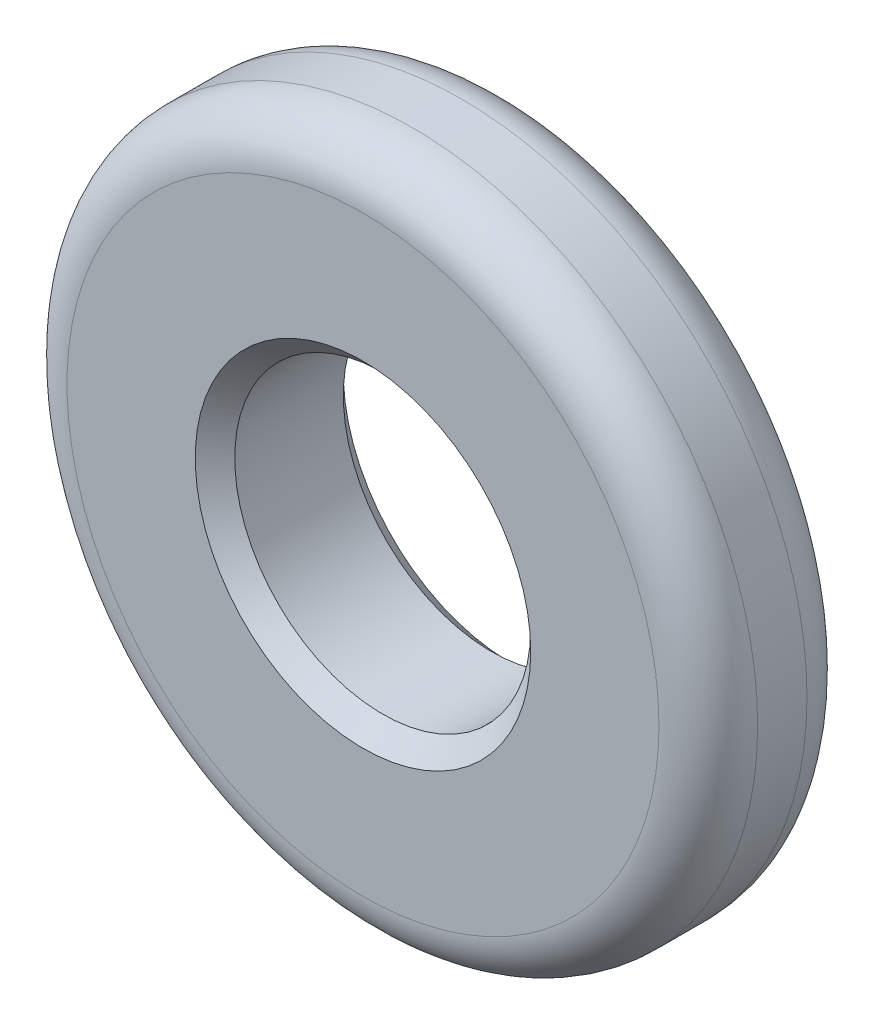
ISO-10303-21;
HEADER;
FILE_DESCRIPTION(('STEP AP214'),'2;1');
FILE_NAME('part.step','',(''),(''),'','','');
FILE_SCHEMA(('AUTOMOTIVE_DESIGN { 1 0 10303 214 1 1 1 1 }'));
ENDSEC;
DATA;
#1=APPLICATION_CONTEXT('core data for automotive mechanical design processes');
#2=APPLICATION_PROTOCOL_DEFINITION('international standard','automotive_design',2000,#1);
#3=PRODUCT_CONTEXT('',#1,'mechanical');
#4=PRODUCT('Part','Part','',(#3));
#5=PRODUCT_RELATED_PRODUCT_CATEGORY('part','',(#4));
#6=PRODUCT_DEFINITION_FORMATION('','',#4);
#7=PRODUCT_DEFINITION_CONTEXT('part definition',#1,'design');
#8=PRODUCT_DEFINITION('design','',#6,#7);
#9=PRODUCT_DEFINITION_SHAPE('','',#8);
#10=(LENGTH_UNIT() NAMED_UNIT(*) SI_UNIT(.MILLI.,.METRE.));
#11=(NAMED_UNIT(*) PLANE_ANGLE_UNIT() SI_UNIT($,.RADIAN.));
#12=(NAMED_UNIT(*) SI_UNIT($,.STERADIAN.) SOLID_ANGLE_UNIT());
#13=UNCERTAINTY_MEASURE_WITH_UNIT(LENGTH_MEASURE(1.E-05),#10,'distance_accuracy_value','');
#14=(GEOMETRIC_REPRESENTATION_CONTEXT(3) GLOBAL_UNCERTAINTY_ASSIGNED_CONTEXT((#13)) GLOBAL_UNIT_ASSIGNED_CONTEXT((#10,
#11,#12)) REPRESENTATION_CONTEXT('',''));
#15=CARTESIAN_POINT('',(0.,0.,0.));
#16=DIRECTION('',(0.,0.,1.));
#17=DIRECTION('',(1.,0.,0.));
#18=AXIS2_PLACEMENT_3D('',#15,#16,#17);
#19=CARTESIAN_POINT('',(0.,0.,4.5));
#20=DIRECTION('',(0.,0.,-1.));
#21=DIRECTION('',(-1.,0.,0.));
#22=AXIS2_PLACEMENT_3D('',#19,#20,#21);
#23=CYLINDRICAL_SURFACE('',#22,21.);
#24=CARTESIAN_POINT('',(0.,0.,-1.5));
#25=DIRECTION('',(0.,0.,1.));
#26=DIRECTION('',(1.,0.,0.));
#27=AXIS2_PLACEMENT_3D('',#24,#25,#26);
#28=CIRCLE('',#27,21.);
#29=CARTESIAN_POINT('',(21.,0.,-1.5));
#30=VERTEX_POINT('',#29);
#31=EDGE_CURVE('E58',#30,#30,#28,.T.);
#32=ORIENTED_EDGE('',*,*,#31,.T.);
#33=EDGE_LOOP('',(#32));
#34=FACE_BOUND('',#33,.T.);
#35=CARTESIAN_POINT('',(0.,0.,1.5));
#36=DIRECTION('',(0.,0.,1.));
#37=DIRECTION('',(1.,0.,0.));
#38=AXIS2_PLACEMENT_3D('',#35,#36,#37);
#39=CIRCLE('',#38,21.);
#40=CARTESIAN_POINT('',(21.,0.,1.5));
#41=VERTEX_POINT('',#40);
#42=EDGE_CURVE('E64',#41,#41,#39,.F.);
#43=ORIENTED_EDGE('',*,*,#42,.T.);
#44=EDGE_LOOP('',(#43));
#45=FACE_BOUND('',#44,.T.);
#46=ADVANCED_FACE('F40',(#34,#45),#23,.T.);
#47=CARTESIAN_POINT('',(0.,0.,4.5));
#48=DIRECTION('',(0.,0.,1.));
#49=DIRECTION('',(1.,0.,0.));
#50=AXIS2_PLACEMENT_3D('',#47,#48,#49);
#51=PLANE('',#50);
#52=CARTESIAN_POINT('',(0.,0.,4.5));
#53=DIRECTION('',(0.,0.,1.));
#54=DIRECTION('',(1.,0.,0.));
#55=AXIS2_PLACEMENT_3D('',#52,#53,#54);
#56=CIRCLE('',#55,10.2);
#57=CARTESIAN_POINT('',(10.2,0.,4.5));
#58=VERTEX_POINT('',#57);
#59=EDGE_CURVE('E48',#58,#58,#56,.F.);
#60=ORIENTED_EDGE('',*,*,#59,.T.);
#61=EDGE_LOOP('',(#60));
#62=FACE_BOUND('',#61,.T.);
#63=CARTESIAN_POINT('',(0.,0.,4.5));
#64=DIRECTION('',(0.,0.,1.));
#65=DIRECTION('',(1.,0.,0.));
#66=AXIS2_PLACEMENT_3D('',#63,#64,#65);
#67=CIRCLE('',#66,18.);
#68=CARTESIAN_POINT('',(18.,0.,4.5));
#69=VERTEX_POINT('',#68);
#70=EDGE_CURVE('E67',#69,#69,#67,.T.);
#71=ORIENTED_EDGE('',*,*,#70,.T.);
#72=EDGE_LOOP('',(#71));
#73=FACE_BOUND('',#72,.T.);
#74=ADVANCED_FACE('F68',(#62,#73),#51,.T.);
#75=CARTESIAN_POINT('',(0.,0.,-4.5));
#76=DIRECTION('',(0.,0.,1.));
#77=DIRECTION('',(1.,0.,0.));
#78=AXIS2_PLACEMENT_3D('',#75,#76,#77);
#79=PLANE('',#78);
#80=CARTESIAN_POINT('',(0.,0.,-4.5));
#81=DIRECTION('',(0.,0.,1.));
#82=DIRECTION('',(1.,0.,0.));
#83=AXIS2_PLACEMENT_3D('',#80,#81,#82);
#84=CIRCLE('',#83,10.2);
#85=CARTESIAN_POINT('',(10.2,0.,-4.5));
#86=VERTEX_POINT('',#85);
#87=EDGE_CURVE('E42',#86,#86,#84,.T.);
#88=ORIENTED_EDGE('',*,*,#87,.T.);
#89=EDGE_LOOP('',(#88));
#90=FACE_BOUND('',#89,.T.);
#91=CARTESIAN_POINT('',(0.,0.,-4.5));
#92=DIRECTION('',(0.,0.,1.));
#93=DIRECTION('',(1.,0.,0.));
#94=AXIS2_PLACEMENT_3D('',#91,#92,#93);
#95=CIRCLE('',#94,18.);
#96=CARTESIAN_POINT('',(18.,0.,-4.5));
#97=VERTEX_POINT('',#96);
#98=EDGE_CURVE('E60',#97,#97,#95,.F.);
#99=ORIENTED_EDGE('',*,*,#98,.T.);
#100=EDGE_LOOP('',(#99));
#101=FACE_BOUND('',#100,.T.);
#102=ADVANCED_FACE('F73',(#90,#101),#79,.F.);
#103=CARTESIAN_POINT('',(0.,0.,1.5));
#104=DIRECTION('',(0.,0.,1.));
#105=DIRECTION('',(1.,0.,0.));
#106=AXIS2_PLACEMENT_3D('',#103,#104,#105);
#107=TOROIDAL_SURFACE('',#106,18.,3.);
#108=ORIENTED_EDGE('',*,*,#42,.F.);
#109=EDGE_LOOP('',(#108));
#110=FACE_BOUND('',#109,.T.);
#111=ORIENTED_EDGE('',*,*,#70,.F.);
#112=EDGE_LOOP('',(#111));
#113=FACE_BOUND('',#112,.T.);
#114=ADVANCED_FACE('F75',(#110,#113),#107,.T.);
#115=CARTESIAN_POINT('',(0.,0.,-1.5));
#116=DIRECTION('',(0.,0.,1.));
#117=DIRECTION('',(1.,0.,0.));
#118=AXIS2_PLACEMENT_3D('',#115,#116,#117);
#119=TOROIDAL_SURFACE('',#118,18.,3.);
#120=ORIENTED_EDGE('',*,*,#98,.F.);
#121=EDGE_LOOP('',(#120));
#122=FACE_BOUND('',#121,.T.);
#123=ORIENTED_EDGE('',*,*,#31,.F.);
#124=EDGE_LOOP('',(#123));
#125=FACE_BOUND('',#124,.T.);
#126=ADVANCED_FACE('F74',(#122,#125),#119,.T.);
#127=CARTESIAN_POINT('',(0.,0.,-4.5));
#128=DIRECTION('',(0.,0.,1.));
#129=DIRECTION('',(1.,0.,0.));
#130=AXIS2_PLACEMENT_3D('',#127,#128,#129);
#131=CYLINDRICAL_SURFACE('',#130,9.);
#132=CARTESIAN_POINT('',(0.,0.,-3.3));
#133=DIRECTION('',(0.,0.,1.));
#134=DIRECTION('',(1.,0.,0.));
#135=AXIS2_PLACEMENT_3D('',#132,#133,#134);
#136=CIRCLE('',#135,9.);
#137=CARTESIAN_POINT('',(9.,0.,-3.3));
#138=VERTEX_POINT('',#137);
#139=EDGE_CURVE('E10',#138,#138,#136,.F.);
#140=ORIENTED_EDGE('',*,*,#139,.T.);
#141=EDGE_LOOP('',(#140));
#142=FACE_BOUND('',#141,.T.);
#143=CARTESIAN_POINT('',(0.,0.,3.3));
#144=DIRECTION('',(0.,0.,1.));
#145=DIRECTION('',(1.,0.,0.));
#146=AXIS2_PLACEMENT_3D('',#143,#144,#145);
#147=CIRCLE('',#146,9.);
#148=CARTESIAN_POINT('',(9.,0.,3.3));
#149=VERTEX_POINT('',#148);
#150=EDGE_CURVE('E55',#149,#149,#147,.T.);
#151=ORIENTED_EDGE('',*,*,#150,.T.);
#152=EDGE_LOOP('',(#151));
#153=FACE_BOUND('',#152,.T.);
#154=ADVANCED_FACE('F84',(#142,#153),#131,.F.);
#155=CARTESIAN_POINT('',(0.,0.,3.3));
#156=DIRECTION('',(0.,0.,1.));
#157=DIRECTION('',(1.,0.,0.));
#158=AXIS2_PLACEMENT_3D('',#155,#156,#157);
#159=CONICAL_SURFACE('',#158,9.,0.785398163397449);
#160=ORIENTED_EDGE('',*,*,#59,.F.);
#161=EDGE_LOOP('',(#160));
#162=FACE_BOUND('',#161,.T.);
#163=ORIENTED_EDGE('',*,*,#150,.F.);
#164=EDGE_LOOP('',(#163));
#165=FACE_BOUND('',#164,.T.);
#166=ADVANCED_FACE('F98',(#162,#165),#159,.F.);
#167=CARTESIAN_POINT('',(0.,0.,-4.5));
#168=DIRECTION('',(0.,0.,-1.));
#169=DIRECTION('',(-1.,0.,0.));
#170=AXIS2_PLACEMENT_3D('',#167,#168,#169);
#171=CONICAL_SURFACE('',#170,10.2,0.785398163397447);
#172=ORIENTED_EDGE('',*,*,#139,.F.);
#173=EDGE_LOOP('',(#172));
#174=FACE_BOUND('',#173,.T.);
#175=ORIENTED_EDGE('',*,*,#87,.F.);
#176=EDGE_LOOP('',(#175));
#177=FACE_BOUND('',#176,.T.);
#178=ADVANCED_FACE('F39',(#174,#177),#171,.F.);
#179=CLOSED_SHELL('',(#46,#74,#102,#114,#126,#154,#166,#178));
#180=MANIFOLD_SOLID_BREP('B2',#179);
#181=ADVANCED_BREP_SHAPE_REPRESENTATION('',(#18,#180),#14);
#182=SHAPE_DEFINITION_REPRESENTATION(#9,#181);
ENDSEC;
END-ISO-10303-21;
